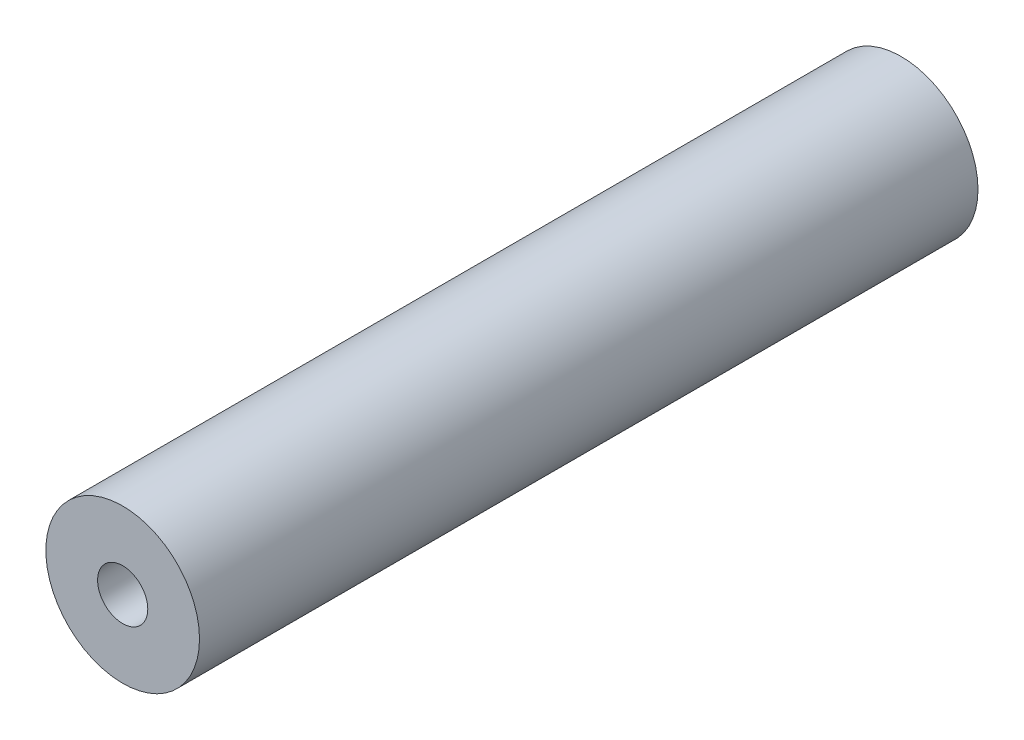
ISO-10303-21;
HEADER;
FILE_DESCRIPTION(('STEP AP214'),'2;1');
FILE_NAME('part.step','',(''),(''),'','','');
FILE_SCHEMA(('AUTOMOTIVE_DESIGN { 1 0 10303 214 1 1 1 1 }'));
ENDSEC;
DATA;
#1=APPLICATION_CONTEXT('core data for automotive mechanical design processes');
#2=APPLICATION_PROTOCOL_DEFINITION('international standard','automotive_design',2000,#1);
#3=PRODUCT_CONTEXT('',#1,'mechanical');
#4=PRODUCT('Part','Part','',(#3));
#5=PRODUCT_RELATED_PRODUCT_CATEGORY('part','',(#4));
#6=PRODUCT_DEFINITION_FORMATION('','',#4);
#7=PRODUCT_DEFINITION_CONTEXT('part definition',#1,'design');
#8=PRODUCT_DEFINITION('design','',#6,#7);
#9=PRODUCT_DEFINITION_SHAPE('','',#8);
#10=(LENGTH_UNIT() NAMED_UNIT(*) SI_UNIT(.MILLI.,.METRE.));
#11=(NAMED_UNIT(*) PLANE_ANGLE_UNIT() SI_UNIT($,.RADIAN.));
#12=(NAMED_UNIT(*) SI_UNIT($,.STERADIAN.) SOLID_ANGLE_UNIT());
#13=UNCERTAINTY_MEASURE_WITH_UNIT(LENGTH_MEASURE(1.E-05),#10,'distance_accuracy_value','');
#14=(GEOMETRIC_REPRESENTATION_CONTEXT(3) GLOBAL_UNCERTAINTY_ASSIGNED_CONTEXT((#13)) GLOBAL_UNIT_ASSIGNED_CONTEXT((#10,
#11,#12)) REPRESENTATION_CONTEXT('',''));
#15=CARTESIAN_POINT('',(0.,0.,0.));
#16=DIRECTION('',(0.,0.,1.));
#17=DIRECTION('',(1.,0.,0.));
#18=AXIS2_PLACEMENT_3D('',#15,#16,#17);
#19=CARTESIAN_POINT('',(0.,0.,152.));
#20=DIRECTION('',(0.,0.,1.));
#21=DIRECTION('',(1.,0.,0.));
#22=AXIS2_PLACEMENT_3D('',#19,#20,#21);
#23=PLANE('',#22);
#24=CARTESIAN_POINT('',(0.,0.,152.));
#25=DIRECTION('',(0.,0.,1.));
#26=DIRECTION('',(1.,0.,0.));
#27=AXIS2_PLACEMENT_3D('',#24,#25,#26);
#28=CIRCLE('',#27,15.);
#29=CARTESIAN_POINT('',(15.,0.,152.));
#30=VERTEX_POINT('',#29);
#31=EDGE_CURVE('E10',#30,#30,#28,.T.);
#32=ORIENTED_EDGE('',*,*,#31,.T.);
#33=EDGE_LOOP('',(#32));
#34=FACE_BOUND('',#33,.T.);
#35=CARTESIAN_POINT('',(0.,0.,152.));
#36=DIRECTION('',(0.,0.,1.));
#37=DIRECTION('',(1.,0.,0.));
#38=AXIS2_PLACEMENT_3D('',#35,#36,#37);
#39=CIRCLE('',#38,4.9);
#40=CARTESIAN_POINT('',(4.9,0.,152.));
#41=VERTEX_POINT('',#40);
#42=EDGE_CURVE('E42',#41,#41,#39,.T.);
#43=ORIENTED_EDGE('',*,*,#42,.F.);
#44=EDGE_LOOP('',(#43));
#45=FACE_BOUND('',#44,.T.);
#46=ADVANCED_FACE('F31',(#34,#45),#23,.T.);
#47=CARTESIAN_POINT('',(0.,0.,0.));
#48=DIRECTION('',(0.,0.,1.));
#49=DIRECTION('',(1.,0.,0.));
#50=AXIS2_PLACEMENT_3D('',#47,#48,#49);
#51=PLANE('',#50);
#52=CARTESIAN_POINT('',(0.,0.,0.));
#53=DIRECTION('',(0.,0.,1.));
#54=DIRECTION('',(1.,0.,0.));
#55=AXIS2_PLACEMENT_3D('',#52,#53,#54);
#56=CIRCLE('',#55,15.);
#57=CARTESIAN_POINT('',(15.,0.,0.));
#58=VERTEX_POINT('',#57);
#59=EDGE_CURVE('E35',#58,#58,#56,.T.);
#60=ORIENTED_EDGE('',*,*,#59,.F.);
#61=EDGE_LOOP('',(#60));
#62=FACE_BOUND('',#61,.T.);
#63=CARTESIAN_POINT('',(0.,0.,0.));
#64=DIRECTION('',(0.,0.,1.));
#65=DIRECTION('',(1.,0.,0.));
#66=AXIS2_PLACEMENT_3D('',#63,#64,#65);
#67=CIRCLE('',#66,4.9);
#68=CARTESIAN_POINT('',(4.9,0.,0.));
#69=VERTEX_POINT('',#68);
#70=EDGE_CURVE('E44',#69,#69,#67,.T.);
#71=ORIENTED_EDGE('',*,*,#70,.T.);
#72=EDGE_LOOP('',(#71));
#73=FACE_BOUND('',#72,.T.);
#74=ADVANCED_FACE('F54',(#62,#73),#51,.F.);
#75=CARTESIAN_POINT('',(0.,0.,152.));
#76=DIRECTION('',(0.,0.,-1.));
#77=DIRECTION('',(-1.,0.,0.));
#78=AXIS2_PLACEMENT_3D('',#75,#76,#77);
#79=CYLINDRICAL_SURFACE('',#78,15.);
#80=ORIENTED_EDGE('',*,*,#31,.F.);
#81=EDGE_LOOP('',(#80));
#82=FACE_BOUND('',#81,.T.);
#83=ORIENTED_EDGE('',*,*,#59,.T.);
#84=EDGE_LOOP('',(#83));
#85=FACE_BOUND('',#84,.T.);
#86=ADVANCED_FACE('F33',(#82,#85),#79,.T.);
#87=CARTESIAN_POINT('',(0.,0.,152.));
#88=DIRECTION('',(0.,0.,-1.));
#89=DIRECTION('',(-1.,0.,0.));
#90=AXIS2_PLACEMENT_3D('',#87,#88,#89);
#91=CYLINDRICAL_SURFACE('',#90,4.9);
#92=ORIENTED_EDGE('',*,*,#42,.T.);
#93=EDGE_LOOP('',(#92));
#94=FACE_BOUND('',#93,.T.);
#95=ORIENTED_EDGE('',*,*,#70,.F.);
#96=EDGE_LOOP('',(#95));
#97=FACE_BOUND('',#96,.T.);
#98=ADVANCED_FACE('F50',(#94,#97),#91,.F.);
#99=CLOSED_SHELL('',(#46,#74,#86,#98));
#100=MANIFOLD_SOLID_BREP('B2',#99);
#101=ADVANCED_BREP_SHAPE_REPRESENTATION('',(#18,#100),#14);
#102=SHAPE_DEFINITION_REPRESENTATION(#9,#101);
ENDSEC;
END-ISO-10303-21;
